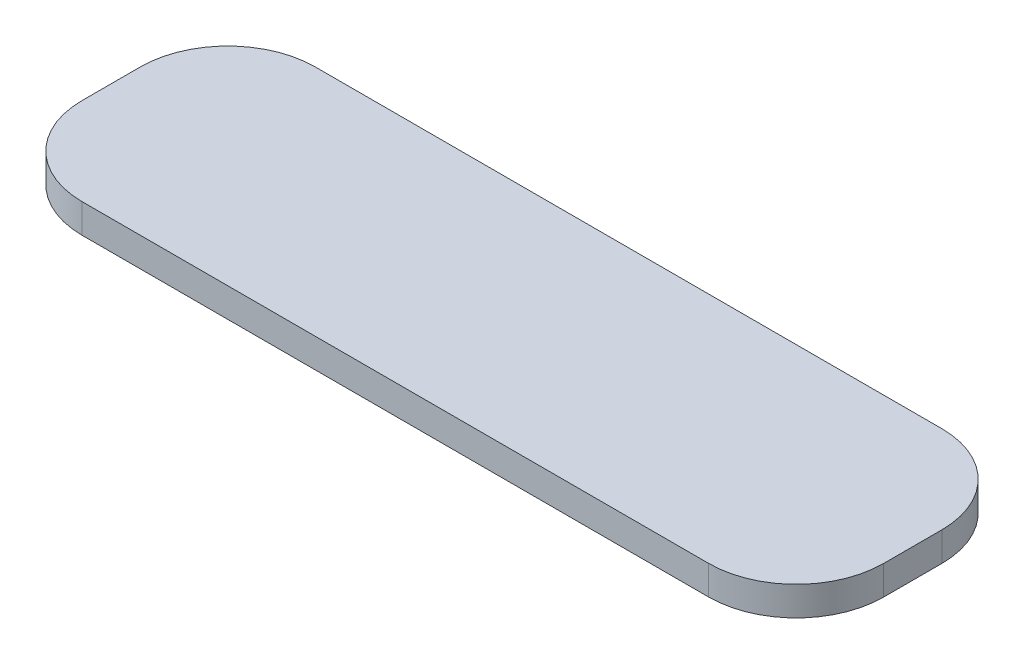
ISO-10303-21;
HEADER;
FILE_DESCRIPTION(('STEP AP214'),'2;1');
FILE_NAME('part.step','',(''),(''),'','','');
FILE_SCHEMA(('AUTOMOTIVE_DESIGN { 1 0 10303 214 1 1 1 1 }'));
ENDSEC;
DATA;
#1=APPLICATION_CONTEXT('core data for automotive mechanical design processes');
#2=APPLICATION_PROTOCOL_DEFINITION('international standard','automotive_design',2000,#1);
#3=PRODUCT_CONTEXT('',#1,'mechanical');
#4=PRODUCT('Part','Part','',(#3));
#5=PRODUCT_RELATED_PRODUCT_CATEGORY('part','',(#4));
#6=PRODUCT_DEFINITION_FORMATION('','',#4);
#7=PRODUCT_DEFINITION_CONTEXT('part definition',#1,'design');
#8=PRODUCT_DEFINITION('design','',#6,#7);
#9=PRODUCT_DEFINITION_SHAPE('','',#8);
#10=(LENGTH_UNIT() NAMED_UNIT(*) SI_UNIT(.MILLI.,.METRE.));
#11=(NAMED_UNIT(*) PLANE_ANGLE_UNIT() SI_UNIT($,.RADIAN.));
#12=(NAMED_UNIT(*) SI_UNIT($,.STERADIAN.) SOLID_ANGLE_UNIT());
#13=UNCERTAINTY_MEASURE_WITH_UNIT(LENGTH_MEASURE(1.E-05),#10,'distance_accuracy_value','');
#14=(GEOMETRIC_REPRESENTATION_CONTEXT(3) GLOBAL_UNCERTAINTY_ASSIGNED_CONTEXT((#13)) GLOBAL_UNIT_ASSIGNED_CONTEXT((#10,
#11,#12)) REPRESENTATION_CONTEXT('',''));
#15=CARTESIAN_POINT('',(0.,0.,0.));
#16=DIRECTION('',(0.,0.,1.));
#17=DIRECTION('',(1.,0.,0.));
#18=AXIS2_PLACEMENT_3D('',#15,#16,#17);
#19=CARTESIAN_POINT('',(181.109466338905,10.,15.4586817691597));
#20=DIRECTION('',(0.,-1.,0.));
#21=DIRECTION('',(0.,0.,-1.));
#22=AXIS2_PLACEMENT_3D('',#19,#20,#21);
#23=CYLINDRICAL_SURFACE('',#22,30.);
#24=CARTESIAN_POINT('',(181.109466338905,0.,15.4586817691597));
#25=DIRECTION('',(0.,1.,0.));
#26=DIRECTION('',(0.,0.,-1.));
#27=AXIS2_PLACEMENT_3D('',#24,#25,#26);
#28=CIRCLE('',#27,30.);
#29=CARTESIAN_POINT('',(211.109466338905,0.,15.45868176916));
#30=VERTEX_POINT('',#29);
#31=CARTESIAN_POINT('',(181.109466338905,0.,-14.5413182308403));
#32=VERTEX_POINT('',#31);
#33=EDGE_CURVE('E131',#30,#32,#28,.T.);
#34=ORIENTED_EDGE('',*,*,#33,.T.);
#35=DIRECTION('',(0.,-1.,0.));
#36=VECTOR('',#35,1.);
#37=CARTESIAN_POINT('',(181.109466338905,10.,-14.5413182308403));
#38=LINE('',#37,#36);
#39=CARTESIAN_POINT('',(181.109466338905,10.,-14.5413182308403));
#40=VERTEX_POINT('',#39);
#41=EDGE_CURVE('E11',#40,#32,#38,.T.);
#42=ORIENTED_EDGE('',*,*,#41,.F.);
#43=CARTESIAN_POINT('',(181.109466338905,10.,15.4586817691597));
#44=DIRECTION('',(0.,1.,0.));
#45=DIRECTION('',(0.,0.,-1.));
#46=AXIS2_PLACEMENT_3D('',#43,#44,#45);
#47=CIRCLE('',#46,30.);
#48=CARTESIAN_POINT('',(211.109466338905,10.,15.45868176916));
#49=VERTEX_POINT('',#48);
#50=EDGE_CURVE('E145',#49,#40,#47,.T.);
#51=ORIENTED_EDGE('',*,*,#50,.F.);
#52=DIRECTION('',(0.,-1.,0.));
#53=VECTOR('',#52,1.);
#54=CARTESIAN_POINT('',(211.109466338905,10.,15.45868176916));
#55=LINE('',#54,#53);
#56=EDGE_CURVE('E127',#49,#30,#55,.T.);
#57=ORIENTED_EDGE('',*,*,#56,.T.);
#58=EDGE_LOOP('',(#34,#42,#51,#57));
#59=FACE_BOUND('',#58,.T.);
#60=ADVANCED_FACE('F35',(#59),#23,.T.);
#61=CARTESIAN_POINT('',(-33.8905336610944,10.,-14.5413182308403));
#62=DIRECTION('',(0.,0.,1.));
#63=DIRECTION('',(1.,0.,0.));
#64=AXIS2_PLACEMENT_3D('',#61,#62,#63);
#65=PLANE('',#64);
#66=DIRECTION('',(-1.,0.,0.));
#67=VECTOR('',#66,1.);
#68=CARTESIAN_POINT('',(-33.8905336610944,0.,-14.5413182308403));
#69=LINE('',#68,#67);
#70=CARTESIAN_POINT('',(-33.8905336610944,0.,-14.5413182308403));
#71=VERTEX_POINT('',#70);
#72=EDGE_CURVE('E134',#32,#71,#69,.T.);
#73=ORIENTED_EDGE('',*,*,#72,.T.);
#74=DIRECTION('',(0.,-1.,0.));
#75=VECTOR('',#74,1.);
#76=CARTESIAN_POINT('',(-33.8905336610944,10.,-14.5413182308403));
#77=LINE('',#76,#75);
#78=CARTESIAN_POINT('',(-33.8905336610944,10.,-14.5413182308403));
#79=VERTEX_POINT('',#78);
#80=EDGE_CURVE('E43',#79,#71,#77,.T.);
#81=ORIENTED_EDGE('',*,*,#80,.F.);
#82=DIRECTION('',(-1.,0.,0.));
#83=VECTOR('',#82,1.);
#84=CARTESIAN_POINT('',(-33.8905336610944,10.,-14.5413182308403));
#85=LINE('',#84,#83);
#86=EDGE_CURVE('E94',#40,#79,#85,.T.);
#87=ORIENTED_EDGE('',*,*,#86,.F.);
#88=ORIENTED_EDGE('',*,*,#41,.T.);
#89=EDGE_LOOP('',(#73,#81,#87,#88));
#90=FACE_BOUND('',#89,.T.);
#91=ADVANCED_FACE('F180',(#90),#65,.F.);
#92=CARTESIAN_POINT('',(-33.8905336610947,10.,15.4586817691597));
#93=DIRECTION('',(0.,-1.,0.));
#94=DIRECTION('',(0.,0.,-1.));
#95=AXIS2_PLACEMENT_3D('',#92,#93,#94);
#96=CYLINDRICAL_SURFACE('',#95,30.);
#97=CARTESIAN_POINT('',(-33.8905336610947,0.,15.4586817691597));
#98=DIRECTION('',(0.,1.,0.));
#99=DIRECTION('',(0.,0.,-1.));
#100=AXIS2_PLACEMENT_3D('',#97,#98,#99);
#101=CIRCLE('',#100,30.);
#102=CARTESIAN_POINT('',(-63.8905336610947,0.,15.45868176916));
#103=VERTEX_POINT('',#102);
#104=EDGE_CURVE('E136',#71,#103,#101,.T.);
#105=ORIENTED_EDGE('',*,*,#104,.T.);
#106=DIRECTION('',(0.,-1.,0.));
#107=VECTOR('',#106,1.);
#108=CARTESIAN_POINT('',(-63.8905336610947,10.,15.45868176916));
#109=LINE('',#108,#107);
#110=CARTESIAN_POINT('',(-63.8905336610947,10.,15.45868176916));
#111=VERTEX_POINT('',#110);
#112=EDGE_CURVE('E152',#111,#103,#109,.T.);
#113=ORIENTED_EDGE('',*,*,#112,.F.);
#114=CARTESIAN_POINT('',(-33.8905336610947,10.,15.4586817691597));
#115=DIRECTION('',(0.,1.,0.));
#116=DIRECTION('',(0.,0.,-1.));
#117=AXIS2_PLACEMENT_3D('',#114,#115,#116);
#118=CIRCLE('',#117,30.);
#119=EDGE_CURVE('E160',#79,#111,#118,.T.);
#120=ORIENTED_EDGE('',*,*,#119,.F.);
#121=ORIENTED_EDGE('',*,*,#80,.T.);
#122=EDGE_LOOP('',(#105,#113,#120,#121));
#123=FACE_BOUND('',#122,.T.);
#124=ADVANCED_FACE('F158',(#123),#96,.T.);
#125=CARTESIAN_POINT('',(-63.8905336610947,10.,35.478802185339));
#126=DIRECTION('',(1.,0.,0.));
#127=DIRECTION('',(0.,0.,-1.));
#128=AXIS2_PLACEMENT_3D('',#125,#126,#127);
#129=PLANE('',#128);
#130=DIRECTION('',(0.,0.,1.));
#131=VECTOR('',#130,1.);
#132=CARTESIAN_POINT('',(-63.8905336610947,0.,35.478802185339));
#133=LINE('',#132,#131);
#134=CARTESIAN_POINT('',(-63.8905336610947,0.,35.478802185339));
#135=VERTEX_POINT('',#134);
#136=EDGE_CURVE('E138',#103,#135,#133,.T.);
#137=ORIENTED_EDGE('',*,*,#136,.T.);
#138=DIRECTION('',(0.,-1.,0.));
#139=VECTOR('',#138,1.);
#140=CARTESIAN_POINT('',(-63.8905336610947,10.,35.478802185339));
#141=LINE('',#140,#139);
#142=CARTESIAN_POINT('',(-63.8905336610947,10.,35.478802185339));
#143=VERTEX_POINT('',#142);
#144=EDGE_CURVE('E149',#143,#135,#141,.T.);
#145=ORIENTED_EDGE('',*,*,#144,.F.);
#146=DIRECTION('',(0.,0.,1.));
#147=VECTOR('',#146,1.);
#148=CARTESIAN_POINT('',(-63.8905336610947,10.,35.478802185339));
#149=LINE('',#148,#147);
#150=EDGE_CURVE('E172',#111,#143,#149,.T.);
#151=ORIENTED_EDGE('',*,*,#150,.F.);
#152=ORIENTED_EDGE('',*,*,#112,.T.);
#153=EDGE_LOOP('',(#137,#145,#151,#152));
#154=FACE_BOUND('',#153,.T.);
#155=ADVANCED_FACE('F168',(#154),#129,.F.);
#156=CARTESIAN_POINT('',(-33.8905336610947,10.,35.4788021853392));
#157=DIRECTION('',(0.,-1.,0.));
#158=DIRECTION('',(0.,0.,-1.));
#159=AXIS2_PLACEMENT_3D('',#156,#157,#158);
#160=CYLINDRICAL_SURFACE('',#159,30.);
#161=CARTESIAN_POINT('',(-33.8905336610947,0.,35.4788021853392));
#162=DIRECTION('',(0.,1.,0.));
#163=DIRECTION('',(0.,0.,-1.));
#164=AXIS2_PLACEMENT_3D('',#161,#162,#163);
#165=CIRCLE('',#164,30.);
#166=CARTESIAN_POINT('',(-33.8905336610945,0.,65.4788021853392));
#167=VERTEX_POINT('',#166);
#168=EDGE_CURVE('E140',#135,#167,#165,.T.);
#169=ORIENTED_EDGE('',*,*,#168,.T.);
#170=DIRECTION('',(0.,-1.,0.));
#171=VECTOR('',#170,1.);
#172=CARTESIAN_POINT('',(-33.8905336610945,10.,65.4788021853392));
#173=LINE('',#172,#171);
#174=CARTESIAN_POINT('',(-33.8905336610945,10.,65.4788021853392));
#175=VERTEX_POINT('',#174);
#176=EDGE_CURVE('E122',#175,#167,#173,.T.);
#177=ORIENTED_EDGE('',*,*,#176,.F.);
#178=CARTESIAN_POINT('',(-33.8905336610947,10.,35.4788021853392));
#179=DIRECTION('',(0.,1.,0.));
#180=DIRECTION('',(0.,0.,-1.));
#181=AXIS2_PLACEMENT_3D('',#178,#179,#180);
#182=CIRCLE('',#181,30.);
#183=EDGE_CURVE('E113',#143,#175,#182,.T.);
#184=ORIENTED_EDGE('',*,*,#183,.F.);
#185=ORIENTED_EDGE('',*,*,#144,.T.);
#186=EDGE_LOOP('',(#169,#177,#184,#185));
#187=FACE_BOUND('',#186,.T.);
#188=ADVANCED_FACE('F171',(#187),#160,.T.);
#189=CARTESIAN_POINT('',(-33.8905336610944,10.,65.4788021853392));
#190=DIRECTION('',(0.,0.,-1.));
#191=DIRECTION('',(-1.,0.,0.));
#192=AXIS2_PLACEMENT_3D('',#189,#190,#191);
#193=PLANE('',#192);
#194=DIRECTION('',(1.,0.,0.));
#195=VECTOR('',#194,1.);
#196=CARTESIAN_POINT('',(-33.8905336610944,0.,65.4788021853392));
#197=LINE('',#196,#195);
#198=CARTESIAN_POINT('',(181.109466338905,0.,65.4788021853392));
#199=VERTEX_POINT('',#198);
#200=EDGE_CURVE('E121',#167,#199,#197,.T.);
#201=ORIENTED_EDGE('',*,*,#200,.T.);
#202=DIRECTION('',(0.,-1.,0.));
#203=VECTOR('',#202,1.);
#204=CARTESIAN_POINT('',(181.109466338905,10.,65.4788021853392));
#205=LINE('',#204,#203);
#206=CARTESIAN_POINT('',(181.109466338905,10.,65.4788021853392));
#207=VERTEX_POINT('',#206);
#208=EDGE_CURVE('E118',#207,#199,#205,.T.);
#209=ORIENTED_EDGE('',*,*,#208,.F.);
#210=DIRECTION('',(1.,0.,0.));
#211=VECTOR('',#210,1.);
#212=CARTESIAN_POINT('',(-33.8905336610944,10.,65.4788021853392));
#213=LINE('',#212,#211);
#214=EDGE_CURVE('E107',#175,#207,#213,.T.);
#215=ORIENTED_EDGE('',*,*,#214,.F.);
#216=ORIENTED_EDGE('',*,*,#176,.T.);
#217=EDGE_LOOP('',(#201,#209,#215,#216));
#218=FACE_BOUND('',#217,.T.);
#219=ADVANCED_FACE('F119',(#218),#193,.F.);
#220=CARTESIAN_POINT('',(181.109466338905,10.,35.4788021853392));
#221=DIRECTION('',(0.,-1.,0.));
#222=DIRECTION('',(0.,0.,-1.));
#223=AXIS2_PLACEMENT_3D('',#220,#221,#222);
#224=CYLINDRICAL_SURFACE('',#223,30.);
#225=CARTESIAN_POINT('',(181.109466338905,0.,35.4788021853392));
#226=DIRECTION('',(0.,1.,0.));
#227=DIRECTION('',(0.,0.,1.));
#228=AXIS2_PLACEMENT_3D('',#225,#226,#227);
#229=CIRCLE('',#228,30.);
#230=CARTESIAN_POINT('',(211.109466338905,0.,35.478802185339));
#231=VERTEX_POINT('',#230);
#232=EDGE_CURVE('E80',#199,#231,#229,.T.);
#233=ORIENTED_EDGE('',*,*,#232,.T.);
#234=DIRECTION('',(0.,-1.,0.));
#235=VECTOR('',#234,1.);
#236=CARTESIAN_POINT('',(211.109466338905,10.,35.478802185339));
#237=LINE('',#236,#235);
#238=CARTESIAN_POINT('',(211.109466338905,10.,35.478802185339));
#239=VERTEX_POINT('',#238);
#240=EDGE_CURVE('E123',#239,#231,#237,.T.);
#241=ORIENTED_EDGE('',*,*,#240,.F.);
#242=CARTESIAN_POINT('',(181.109466338905,10.,35.4788021853392));
#243=DIRECTION('',(0.,1.,0.));
#244=DIRECTION('',(0.,0.,1.));
#245=AXIS2_PLACEMENT_3D('',#242,#243,#244);
#246=CIRCLE('',#245,30.);
#247=EDGE_CURVE('E111',#207,#239,#246,.T.);
#248=ORIENTED_EDGE('',*,*,#247,.F.);
#249=ORIENTED_EDGE('',*,*,#208,.T.);
#250=EDGE_LOOP('',(#233,#241,#248,#249));
#251=FACE_BOUND('',#250,.T.);
#252=ADVANCED_FACE('F125',(#251),#224,.T.);
#253=CARTESIAN_POINT('',(211.109466338905,10.,35.478802185339));
#254=DIRECTION('',(-1.,0.,0.));
#255=DIRECTION('',(0.,0.,1.));
#256=AXIS2_PLACEMENT_3D('',#253,#254,#255);
#257=PLANE('',#256);
#258=DIRECTION('',(0.,0.,-1.));
#259=VECTOR('',#258,1.);
#260=CARTESIAN_POINT('',(211.109466338905,0.,35.478802185339));
#261=LINE('',#260,#259);
#262=EDGE_CURVE('E86',#231,#30,#261,.T.);
#263=ORIENTED_EDGE('',*,*,#262,.T.);
#264=ORIENTED_EDGE('',*,*,#56,.F.);
#265=DIRECTION('',(0.,0.,-1.));
#266=VECTOR('',#265,1.);
#267=CARTESIAN_POINT('',(211.109466338905,10.,35.478802185339));
#268=LINE('',#267,#266);
#269=EDGE_CURVE('E51',#239,#49,#268,.T.);
#270=ORIENTED_EDGE('',*,*,#269,.F.);
#271=ORIENTED_EDGE('',*,*,#240,.T.);
#272=EDGE_LOOP('',(#263,#264,#270,#271));
#273=FACE_BOUND('',#272,.T.);
#274=ADVANCED_FACE('F196',(#273),#257,.F.);
#275=CARTESIAN_POINT('',(181.109466338905,10.,15.4586817691597));
#276=DIRECTION('',(0.,-1.,0.));
#277=DIRECTION('',(0.,0.,-1.));
#278=AXIS2_PLACEMENT_3D('',#275,#276,#277);
#279=PLANE('',#278);
#280=ORIENTED_EDGE('',*,*,#50,.T.);
#281=ORIENTED_EDGE('',*,*,#86,.T.);
#282=ORIENTED_EDGE('',*,*,#119,.T.);
#283=ORIENTED_EDGE('',*,*,#150,.T.);
#284=ORIENTED_EDGE('',*,*,#183,.T.);
#285=ORIENTED_EDGE('',*,*,#214,.T.);
#286=ORIENTED_EDGE('',*,*,#247,.T.);
#287=ORIENTED_EDGE('',*,*,#269,.T.);
#288=EDGE_LOOP('',(#280,#281,#282,#283,#284,#285,#286,#287));
#289=FACE_BOUND('',#288,.T.);
#290=ADVANCED_FACE('F109',(#289),#279,.F.);
#291=CARTESIAN_POINT('',(181.109466338905,0.,15.4586817691597));
#292=DIRECTION('',(0.,-1.,0.));
#293=DIRECTION('',(0.,0.,-1.));
#294=AXIS2_PLACEMENT_3D('',#291,#292,#293);
#295=PLANE('',#294);
#296=ORIENTED_EDGE('',*,*,#33,.F.);
#297=ORIENTED_EDGE('',*,*,#262,.F.);
#298=ORIENTED_EDGE('',*,*,#232,.F.);
#299=ORIENTED_EDGE('',*,*,#200,.F.);
#300=ORIENTED_EDGE('',*,*,#168,.F.);
#301=ORIENTED_EDGE('',*,*,#136,.F.);
#302=ORIENTED_EDGE('',*,*,#104,.F.);
#303=ORIENTED_EDGE('',*,*,#72,.F.);
#304=EDGE_LOOP('',(#296,#297,#298,#299,#300,#301,#302,#303));
#305=FACE_BOUND('',#304,.T.);
#306=ADVANCED_FACE('F164',(#305),#295,.T.);
#307=CLOSED_SHELL('',(#60,#91,#124,#155,#188,#219,#252,#274,#290,#306));
#308=MANIFOLD_SOLID_BREP('B2',#307);
#309=ADVANCED_BREP_SHAPE_REPRESENTATION('',(#18,#308),#14);
#310=SHAPE_DEFINITION_REPRESENTATION(#9,#309);
ENDSEC;
END-ISO-10303-21;
